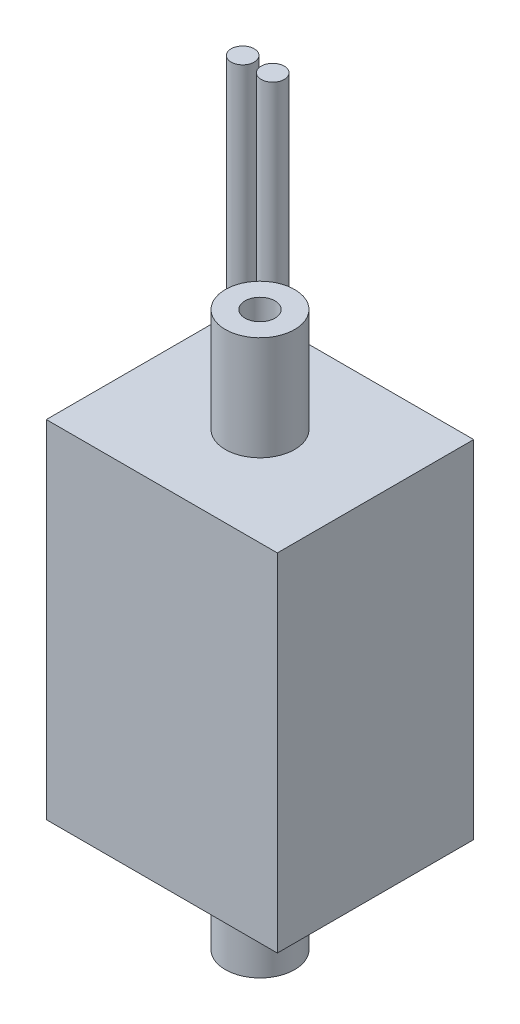
ISO-10303-21;
HEADER;
FILE_DESCRIPTION(('STEP AP214'),'2;1');
FILE_NAME('part.step','',(''),(''),'','','');
FILE_SCHEMA(('AUTOMOTIVE_DESIGN { 1 0 10303 214 1 1 1 1 }'));
ENDSEC;
DATA;
#1=APPLICATION_CONTEXT('core data for automotive mechanical design processes');
#2=APPLICATION_PROTOCOL_DEFINITION('international standard','automotive_design',2000,#1);
#3=PRODUCT_CONTEXT('',#1,'mechanical');
#4=PRODUCT('Part','Part','',(#3));
#5=PRODUCT_RELATED_PRODUCT_CATEGORY('part','',(#4));
#6=PRODUCT_DEFINITION_FORMATION('','',#4);
#7=PRODUCT_DEFINITION_CONTEXT('part definition',#1,'design');
#8=PRODUCT_DEFINITION('design','',#6,#7);
#9=PRODUCT_DEFINITION_SHAPE('','',#8);
#10=(LENGTH_UNIT() NAMED_UNIT(*) SI_UNIT(.MILLI.,.METRE.));
#11=(NAMED_UNIT(*) PLANE_ANGLE_UNIT() SI_UNIT($,.RADIAN.));
#12=(NAMED_UNIT(*) SI_UNIT($,.STERADIAN.) SOLID_ANGLE_UNIT());
#13=UNCERTAINTY_MEASURE_WITH_UNIT(LENGTH_MEASURE(1.E-05),#10,'distance_accuracy_value','');
#14=(GEOMETRIC_REPRESENTATION_CONTEXT(3) GLOBAL_UNCERTAINTY_ASSIGNED_CONTEXT((#13)) GLOBAL_UNIT_ASSIGNED_CONTEXT((#10,
#11,#12)) REPRESENTATION_CONTEXT('',''));
#15=CARTESIAN_POINT('',(0.,0.,0.));
#16=DIRECTION('',(0.,0.,1.));
#17=DIRECTION('',(1.,0.,0.));
#18=AXIS2_PLACEMENT_3D('',#15,#16,#17);
#19=CARTESIAN_POINT('',(5.,19.5,4.25));
#20=DIRECTION('',(0.,1.,0.));
#21=DIRECTION('',(0.,0.,1.));
#22=AXIS2_PLACEMENT_3D('',#19,#20,#21);
#23=PLANE('',#22);
#24=CARTESIAN_POINT('',(5.,19.5,4.25));
#25=DIRECTION('',(0.,1.,0.));
#26=DIRECTION('',(0.,0.,1.));
#27=AXIS2_PLACEMENT_3D('',#24,#25,#26);
#28=CIRCLE('',#27,1.5);
#29=CARTESIAN_POINT('',(5.,19.5,5.75));
#30=VERTEX_POINT('',#29);
#31=EDGE_CURVE('E11',#30,#30,#28,.T.);
#32=ORIENTED_EDGE('',*,*,#31,.T.);
#33=EDGE_LOOP('',(#32));
#34=FACE_BOUND('',#33,.T.);
#35=CARTESIAN_POINT('',(5.,19.5,4.25));
#36=DIRECTION('',(0.,1.,0.));
#37=DIRECTION('',(0.,0.,1.));
#38=AXIS2_PLACEMENT_3D('',#35,#36,#37);
#39=CIRCLE('',#38,0.65);
#40=CARTESIAN_POINT('',(5.,19.5,4.9));
#41=VERTEX_POINT('',#40);
#42=EDGE_CURVE('E53',#41,#41,#39,.T.);
#43=ORIENTED_EDGE('',*,*,#42,.F.);
#44=EDGE_LOOP('',(#43));
#45=FACE_BOUND('',#44,.T.);
#46=ADVANCED_FACE('F42',(#34,#45),#23,.T.);
#47=CARTESIAN_POINT('',(5.,15.,4.25));
#48=DIRECTION('',(0.,1.,0.));
#49=DIRECTION('',(0.,0.,1.));
#50=AXIS2_PLACEMENT_3D('',#47,#48,#49);
#51=PLANE('',#50);
#52=CARTESIAN_POINT('',(5.,15.,4.25));
#53=DIRECTION('',(0.,1.,0.));
#54=DIRECTION('',(0.,0.,1.));
#55=AXIS2_PLACEMENT_3D('',#52,#53,#54);
#56=CIRCLE('',#55,1.5);
#57=CARTESIAN_POINT('',(5.,15.,5.75));
#58=VERTEX_POINT('',#57);
#59=EDGE_CURVE('E46',#58,#58,#56,.T.);
#60=ORIENTED_EDGE('',*,*,#59,.F.);
#61=EDGE_LOOP('',(#60));
#62=FACE_BOUND('',#61,.T.);
#63=CARTESIAN_POINT('',(5.,15.,4.25));
#64=DIRECTION('',(0.,1.,0.));
#65=DIRECTION('',(0.,0.,1.));
#66=AXIS2_PLACEMENT_3D('',#63,#64,#65);
#67=CIRCLE('',#66,0.65);
#68=CARTESIAN_POINT('',(5.,15.,4.9));
#69=VERTEX_POINT('',#68);
#70=EDGE_CURVE('E55',#69,#69,#67,.T.);
#71=ORIENTED_EDGE('',*,*,#70,.T.);
#72=EDGE_LOOP('',(#71));
#73=FACE_BOUND('',#72,.T.);
#74=ADVANCED_FACE('F65',(#62,#73),#51,.F.);
#75=CARTESIAN_POINT('',(5.,19.5,4.25));
#76=DIRECTION('',(0.,-1.,0.));
#77=DIRECTION('',(0.,0.,-1.));
#78=AXIS2_PLACEMENT_3D('',#75,#76,#77);
#79=CYLINDRICAL_SURFACE('',#78,1.5);
#80=ORIENTED_EDGE('',*,*,#31,.F.);
#81=EDGE_LOOP('',(#80));
#82=FACE_BOUND('',#81,.T.);
#83=ORIENTED_EDGE('',*,*,#59,.T.);
#84=EDGE_LOOP('',(#83));
#85=FACE_BOUND('',#84,.T.);
#86=ADVANCED_FACE('F44',(#82,#85),#79,.T.);
#87=CARTESIAN_POINT('',(5.,19.5,4.25));
#88=DIRECTION('',(0.,-1.,0.));
#89=DIRECTION('',(0.,0.,-1.));
#90=AXIS2_PLACEMENT_3D('',#87,#88,#89);
#91=CYLINDRICAL_SURFACE('',#90,0.65);
#92=ORIENTED_EDGE('',*,*,#42,.T.);
#93=EDGE_LOOP('',(#92));
#94=FACE_BOUND('',#93,.T.);
#95=ORIENTED_EDGE('',*,*,#70,.F.);
#96=EDGE_LOOP('',(#95));
#97=FACE_BOUND('',#96,.T.);
#98=ADVANCED_FACE('F61',(#94,#97),#91,.F.);
#99=CLOSED_SHELL('',(#46,#74,#86,#98));
#100=MANIFOLD_SOLID_BREP('B2',#99);
#101=CARTESIAN_POINT('',(0.,0.,8.5));
#102=DIRECTION('',(1.,0.,0.));
#103=DIRECTION('',(0.,0.,-1.));
#104=AXIS2_PLACEMENT_3D('',#101,#102,#103);
#105=PLANE('',#104);
#106=DIRECTION('',(0.,-1.,0.));
#107=VECTOR('',#106,1.);
#108=CARTESIAN_POINT('',(0.,0.,0.));
#109=LINE('',#108,#107);
#110=CARTESIAN_POINT('',(0.,15.,0.));
#111=VERTEX_POINT('',#110);
#112=CARTESIAN_POINT('',(0.,0.,0.));
#113=VERTEX_POINT('',#112);
#114=EDGE_CURVE('E170',#111,#113,#109,.T.);
#115=ORIENTED_EDGE('',*,*,#114,.T.);
#116=DIRECTION('',(0.,0.,-1.));
#117=VECTOR('',#116,1.);
#118=CARTESIAN_POINT('',(0.,0.,8.5));
#119=LINE('',#118,#117);
#120=CARTESIAN_POINT('',(0.,0.,8.5));
#121=VERTEX_POINT('',#120);
#122=EDGE_CURVE('E161',#121,#113,#119,.T.);
#123=ORIENTED_EDGE('',*,*,#122,.F.);
#124=DIRECTION('',(0.,-1.,0.));
#125=VECTOR('',#124,1.);
#126=CARTESIAN_POINT('',(0.,0.,8.5));
#127=LINE('',#126,#125);
#128=CARTESIAN_POINT('',(0.,15.,8.5));
#129=VERTEX_POINT('',#128);
#130=EDGE_CURVE('E155',#129,#121,#127,.T.);
#131=ORIENTED_EDGE('',*,*,#130,.F.);
#132=DIRECTION('',(0.,0.,-1.));
#133=VECTOR('',#132,1.);
#134=CARTESIAN_POINT('',(0.,15.,8.5));
#135=LINE('',#134,#133);
#136=EDGE_CURVE('E166',#129,#111,#135,.T.);
#137=ORIENTED_EDGE('',*,*,#136,.T.);
#138=EDGE_LOOP('',(#115,#123,#131,#137));
#139=FACE_BOUND('',#138,.T.);
#140=ADVANCED_FACE('F103',(#139),#105,.F.);
#141=CARTESIAN_POINT('',(0.,0.,8.5));
#142=DIRECTION('',(0.,1.,0.));
#143=DIRECTION('',(0.,0.,1.));
#144=AXIS2_PLACEMENT_3D('',#141,#142,#143);
#145=PLANE('',#144);
#146=CARTESIAN_POINT('',(5.,0.,4.25));
#147=DIRECTION('',(0.,-1.,0.));
#148=DIRECTION('',(0.,0.,-1.));
#149=AXIS2_PLACEMENT_3D('',#146,#147,#148);
#150=CIRCLE('',#149,1.5);
#151=CARTESIAN_POINT('',(5.,0.,2.75));
#152=VERTEX_POINT('',#151);
#153=EDGE_CURVE('E179',#152,#152,#150,.T.);
#154=ORIENTED_EDGE('',*,*,#153,.F.);
#155=EDGE_LOOP('',(#154));
#156=FACE_BOUND('',#155,.T.);
#157=DIRECTION('',(1.,0.,0.));
#158=VECTOR('',#157,1.);
#159=CARTESIAN_POINT('',(0.,0.,0.));
#160=LINE('',#159,#158);
#161=CARTESIAN_POINT('',(10.,0.,0.));
#162=VERTEX_POINT('',#161);
#163=EDGE_CURVE('E160',#113,#162,#160,.T.);
#164=ORIENTED_EDGE('',*,*,#163,.T.);
#165=DIRECTION('',(0.,0.,-1.));
#166=VECTOR('',#165,1.);
#167=CARTESIAN_POINT('',(10.,0.,8.5));
#168=LINE('',#167,#166);
#169=CARTESIAN_POINT('',(10.,0.,8.5));
#170=VERTEX_POINT('',#169);
#171=EDGE_CURVE('E158',#170,#162,#168,.T.);
#172=ORIENTED_EDGE('',*,*,#171,.F.);
#173=DIRECTION('',(1.,0.,0.));
#174=VECTOR('',#173,1.);
#175=CARTESIAN_POINT('',(0.,0.,8.5));
#176=LINE('',#175,#174);
#177=EDGE_CURVE('E150',#121,#170,#176,.T.);
#178=ORIENTED_EDGE('',*,*,#177,.F.);
#179=ORIENTED_EDGE('',*,*,#122,.T.);
#180=EDGE_LOOP('',(#164,#172,#178,#179));
#181=FACE_BOUND('',#180,.T.);
#182=ADVANCED_FACE('F159',(#156,#181),#145,.F.);
#183=CARTESIAN_POINT('',(10.,0.,8.5));
#184=DIRECTION('',(-1.,0.,0.));
#185=DIRECTION('',(0.,0.,1.));
#186=AXIS2_PLACEMENT_3D('',#183,#184,#185);
#187=PLANE('',#186);
#188=DIRECTION('',(0.,1.,0.));
#189=VECTOR('',#188,1.);
#190=CARTESIAN_POINT('',(10.,0.,0.));
#191=LINE('',#190,#189);
#192=CARTESIAN_POINT('',(10.,15.,0.));
#193=VERTEX_POINT('',#192);
#194=EDGE_CURVE('E136',#162,#193,#191,.T.);
#195=ORIENTED_EDGE('',*,*,#194,.T.);
#196=DIRECTION('',(0.,0.,-1.));
#197=VECTOR('',#196,1.);
#198=CARTESIAN_POINT('',(10.,15.,8.5));
#199=LINE('',#198,#197);
#200=CARTESIAN_POINT('',(10.,15.,8.5));
#201=VERTEX_POINT('',#200);
#202=EDGE_CURVE('E162',#201,#193,#199,.T.);
#203=ORIENTED_EDGE('',*,*,#202,.F.);
#204=DIRECTION('',(0.,1.,0.));
#205=VECTOR('',#204,1.);
#206=CARTESIAN_POINT('',(10.,0.,8.5));
#207=LINE('',#206,#205);
#208=EDGE_CURVE('E153',#170,#201,#207,.T.);
#209=ORIENTED_EDGE('',*,*,#208,.F.);
#210=ORIENTED_EDGE('',*,*,#171,.T.);
#211=EDGE_LOOP('',(#195,#203,#209,#210));
#212=FACE_BOUND('',#211,.T.);
#213=ADVANCED_FACE('F164',(#212),#187,.F.);
#214=CARTESIAN_POINT('',(0.,15.,8.5));
#215=DIRECTION('',(0.,-1.,0.));
#216=DIRECTION('',(0.,0.,-1.));
#217=AXIS2_PLACEMENT_3D('',#214,#215,#216);
#218=PLANE('',#217);
#219=CARTESIAN_POINT('',(1.9,15.,0.6));
#220=DIRECTION('',(0.,-1.,0.));
#221=DIRECTION('',(0.,0.,-1.));
#222=AXIS2_PLACEMENT_3D('',#219,#220,#221);
#223=CIRCLE('',#222,0.5);
#224=CARTESIAN_POINT('',(1.9,15.,0.1));
#225=VERTEX_POINT('',#224);
#226=EDGE_CURVE('E40',#225,#225,#223,.F.);
#227=ORIENTED_EDGE('',*,*,#226,.F.);
#228=EDGE_LOOP('',(#227));
#229=FACE_BOUND('',#228,.T.);
#230=CARTESIAN_POINT('',(0.6,15.,0.6));
#231=DIRECTION('',(0.,-1.,0.));
#232=DIRECTION('',(0.,0.,-1.));
#233=AXIS2_PLACEMENT_3D('',#230,#231,#232);
#234=CIRCLE('',#233,0.5);
#235=CARTESIAN_POINT('',(0.6,15.,0.0999999999999996));
#236=VERTEX_POINT('',#235);
#237=EDGE_CURVE('E111',#236,#236,#234,.F.);
#238=ORIENTED_EDGE('',*,*,#237,.F.);
#239=EDGE_LOOP('',(#238));
#240=FACE_BOUND('',#239,.T.);
#241=DIRECTION('',(-1.,0.,0.));
#242=VECTOR('',#241,1.);
#243=CARTESIAN_POINT('',(0.,15.,0.));
#244=LINE('',#243,#242);
#245=EDGE_CURVE('E142',#193,#111,#244,.T.);
#246=ORIENTED_EDGE('',*,*,#245,.T.);
#247=ORIENTED_EDGE('',*,*,#136,.F.);
#248=DIRECTION('',(-1.,0.,0.));
#249=VECTOR('',#248,1.);
#250=CARTESIAN_POINT('',(0.,15.,8.5));
#251=LINE('',#250,#249);
#252=EDGE_CURVE('E119',#201,#129,#251,.T.);
#253=ORIENTED_EDGE('',*,*,#252,.F.);
#254=ORIENTED_EDGE('',*,*,#202,.T.);
#255=EDGE_LOOP('',(#246,#247,#253,#254));
#256=FACE_BOUND('',#255,.T.);
#257=ADVANCED_FACE('F212',(#229,#240,#256),#218,.F.);
#258=CARTESIAN_POINT('',(0.,0.,8.5));
#259=DIRECTION('',(0.,0.,-1.));
#260=DIRECTION('',(-1.,0.,0.));
#261=AXIS2_PLACEMENT_3D('',#258,#259,#260);
#262=PLANE('',#261);
#263=ORIENTED_EDGE('',*,*,#130,.T.);
#264=ORIENTED_EDGE('',*,*,#177,.T.);
#265=ORIENTED_EDGE('',*,*,#208,.T.);
#266=ORIENTED_EDGE('',*,*,#252,.T.);
#267=EDGE_LOOP('',(#263,#264,#265,#266));
#268=FACE_BOUND('',#267,.T.);
#269=ADVANCED_FACE('F151',(#268),#262,.F.);
#270=CARTESIAN_POINT('',(0.,0.,0.));
#271=DIRECTION('',(0.,0.,-1.));
#272=DIRECTION('',(-1.,0.,0.));
#273=AXIS2_PLACEMENT_3D('',#270,#271,#272);
#274=PLANE('',#273);
#275=ORIENTED_EDGE('',*,*,#114,.F.);
#276=ORIENTED_EDGE('',*,*,#245,.F.);
#277=ORIENTED_EDGE('',*,*,#194,.F.);
#278=ORIENTED_EDGE('',*,*,#163,.F.);
#279=EDGE_LOOP('',(#275,#276,#277,#278));
#280=FACE_BOUND('',#279,.T.);
#281=ADVANCED_FACE('F220',(#280),#274,.T.);
#282=CARTESIAN_POINT('',(5.,-4.5,4.25));
#283=DIRECTION('',(0.,-1.,0.));
#284=DIRECTION('',(0.,0.,-1.));
#285=AXIS2_PLACEMENT_3D('',#282,#283,#284);
#286=PLANE('',#285);
#287=CARTESIAN_POINT('',(5.,-4.5,4.25));
#288=DIRECTION('',(0.,-1.,0.));
#289=DIRECTION('',(0.,0.,-1.));
#290=AXIS2_PLACEMENT_3D('',#287,#288,#289);
#291=CIRCLE('',#290,1.5);
#292=CARTESIAN_POINT('',(5.,-4.5,2.75));
#293=VERTEX_POINT('',#292);
#294=EDGE_CURVE('E173',#293,#293,#291,.T.);
#295=ORIENTED_EDGE('',*,*,#294,.T.);
#296=EDGE_LOOP('',(#295));
#297=FACE_BOUND('',#296,.T.);
#298=CARTESIAN_POINT('',(5.,-4.5,4.25));
#299=DIRECTION('',(0.,-1.,0.));
#300=DIRECTION('',(0.,0.,-1.));
#301=AXIS2_PLACEMENT_3D('',#298,#299,#300);
#302=CIRCLE('',#301,0.5);
#303=CARTESIAN_POINT('',(5.,-4.5,3.75));
#304=VERTEX_POINT('',#303);
#305=EDGE_CURVE('E190',#304,#304,#302,.T.);
#306=ORIENTED_EDGE('',*,*,#305,.F.);
#307=EDGE_LOOP('',(#306));
#308=FACE_BOUND('',#307,.T.);
#309=ADVANCED_FACE('F234',(#297,#308),#286,.T.);
#310=CARTESIAN_POINT('',(5.,-4.5,4.25));
#311=DIRECTION('',(0.,1.,0.));
#312=DIRECTION('',(0.,0.,1.));
#313=AXIS2_PLACEMENT_3D('',#310,#311,#312);
#314=CYLINDRICAL_SURFACE('',#313,1.5);
#315=ORIENTED_EDGE('',*,*,#294,.F.);
#316=EDGE_LOOP('',(#315));
#317=FACE_BOUND('',#316,.T.);
#318=ORIENTED_EDGE('',*,*,#153,.T.);
#319=EDGE_LOOP('',(#318));
#320=FACE_BOUND('',#319,.T.);
#321=ADVANCED_FACE('F238',(#317,#320),#314,.T.);
#322=CARTESIAN_POINT('',(5.,-4.5,4.25));
#323=DIRECTION('',(0.,1.,0.));
#324=DIRECTION('',(0.,0.,1.));
#325=AXIS2_PLACEMENT_3D('',#322,#323,#324);
#326=CYLINDRICAL_SURFACE('',#325,0.5);
#327=ORIENTED_EDGE('',*,*,#305,.T.);
#328=EDGE_LOOP('',(#327));
#329=FACE_BOUND('',#328,.T.);
#330=CARTESIAN_POINT('',(5.,0.,4.25));
#331=DIRECTION('',(0.,-1.,0.));
#332=DIRECTION('',(0.,0.,-1.));
#333=AXIS2_PLACEMENT_3D('',#330,#331,#332);
#334=CIRCLE('',#333,0.5);
#335=CARTESIAN_POINT('',(5.,0.,3.75));
#336=VERTEX_POINT('',#335);
#337=EDGE_CURVE('E191',#336,#336,#334,.T.);
#338=ORIENTED_EDGE('',*,*,#337,.F.);
#339=EDGE_LOOP('',(#338));
#340=FACE_BOUND('',#339,.T.);
#341=ADVANCED_FACE('F243',(#329,#340),#326,.F.);
#342=ORIENTED_EDGE('',*,*,#337,.T.);
#343=EDGE_LOOP('',(#342));
#344=FACE_BOUND('',#343,.T.);
#345=ADVANCED_FACE('F230',(#344),#145,.F.);
#346=CARTESIAN_POINT('',(0.6,25.,0.6));
#347=DIRECTION('',(0.,-1.,0.));
#348=DIRECTION('',(0.,0.,-1.));
#349=AXIS2_PLACEMENT_3D('',#346,#347,#348);
#350=CYLINDRICAL_SURFACE('',#349,0.5);
#351=CARTESIAN_POINT('',(0.6,25.,0.6));
#352=DIRECTION('',(0.,1.,0.));
#353=DIRECTION('',(0.,0.,1.));
#354=AXIS2_PLACEMENT_3D('',#351,#352,#353);
#355=CIRCLE('',#354,0.5);
#356=CARTESIAN_POINT('',(0.6,25.,1.1));
#357=VERTEX_POINT('',#356);
#358=EDGE_CURVE('E194',#357,#357,#355,.T.);
#359=ORIENTED_EDGE('',*,*,#358,.F.);
#360=EDGE_LOOP('',(#359));
#361=FACE_BOUND('',#360,.T.);
#362=ORIENTED_EDGE('',*,*,#237,.T.);
#363=EDGE_LOOP('',(#362));
#364=FACE_BOUND('',#363,.T.);
#365=ADVANCED_FACE('F249',(#361,#364),#350,.T.);
#366=CARTESIAN_POINT('',(0.6,25.,0.6));
#367=DIRECTION('',(0.,1.,0.));
#368=DIRECTION('',(0.,0.,1.));
#369=AXIS2_PLACEMENT_3D('',#366,#367,#368);
#370=PLANE('',#369);
#371=ORIENTED_EDGE('',*,*,#358,.T.);
#372=EDGE_LOOP('',(#371));
#373=FACE_BOUND('',#372,.T.);
#374=ADVANCED_FACE('F208',(#373),#370,.T.);
#375=CARTESIAN_POINT('',(1.9,25.,0.6));
#376=DIRECTION('',(0.,-1.,0.));
#377=DIRECTION('',(0.,0.,-1.));
#378=AXIS2_PLACEMENT_3D('',#375,#376,#377);
#379=CYLINDRICAL_SURFACE('',#378,0.5);
#380=CARTESIAN_POINT('',(1.9,25.,0.6));
#381=DIRECTION('',(0.,1.,0.));
#382=DIRECTION('',(0.,0.,1.));
#383=AXIS2_PLACEMENT_3D('',#380,#381,#382);
#384=CIRCLE('',#383,0.5);
#385=CARTESIAN_POINT('',(1.9,25.,1.1));
#386=VERTEX_POINT('',#385);
#387=EDGE_CURVE('E199',#386,#386,#384,.T.);
#388=ORIENTED_EDGE('',*,*,#387,.F.);
#389=EDGE_LOOP('',(#388));
#390=FACE_BOUND('',#389,.T.);
#391=ORIENTED_EDGE('',*,*,#226,.T.);
#392=EDGE_LOOP('',(#391));
#393=FACE_BOUND('',#392,.T.);
#394=ADVANCED_FACE('F205',(#390,#393),#379,.T.);
#395=CARTESIAN_POINT('',(1.9,25.,0.6));
#396=DIRECTION('',(0.,1.,0.));
#397=DIRECTION('',(0.,0.,1.));
#398=AXIS2_PLACEMENT_3D('',#395,#396,#397);
#399=PLANE('',#398);
#400=ORIENTED_EDGE('',*,*,#387,.T.);
#401=EDGE_LOOP('',(#400));
#402=FACE_BOUND('',#401,.T.);
#403=ADVANCED_FACE('F203',(#402),#399,.T.);
#404=CLOSED_SHELL('',(#140,#182,#213,#257,#269,#281,#309,#321,#341,#345,#365,#374,#394,#403));
#405=MANIFOLD_SOLID_BREP('B6',#404);
#406=ADVANCED_BREP_SHAPE_REPRESENTATION('',(#18,#100,#405),#14);
#407=SHAPE_DEFINITION_REPRESENTATION(#9,#406);
ENDSEC;
END-ISO-10303-21;
